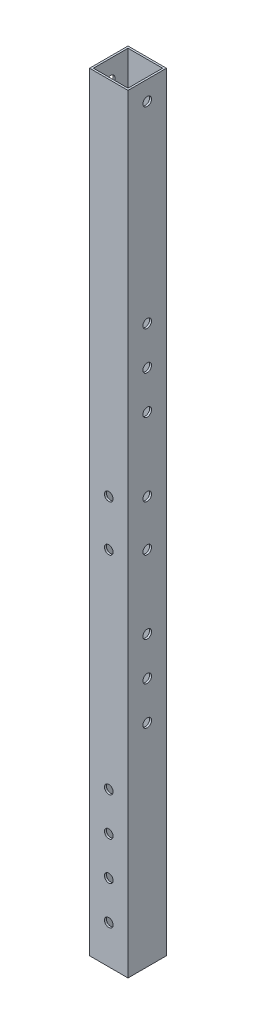
ISO-10303-21;
HEADER;
FILE_DESCRIPTION(('STEP AP214'),'2;1');
FILE_NAME('part.step','',(''),(''),'','','');
FILE_SCHEMA(('AUTOMOTIVE_DESIGN { 1 0 10303 214 1 1 1 1 }'));
ENDSEC;
DATA;
#1=APPLICATION_CONTEXT('core data for automotive mechanical design processes');
#2=APPLICATION_PROTOCOL_DEFINITION('international standard','automotive_design',2000,#1);
#3=PRODUCT_CONTEXT('',#1,'mechanical');
#4=PRODUCT('Part','Part','',(#3));
#5=PRODUCT_RELATED_PRODUCT_CATEGORY('part','',(#4));
#6=PRODUCT_DEFINITION_FORMATION('','',#4);
#7=PRODUCT_DEFINITION_CONTEXT('part definition',#1,'design');
#8=PRODUCT_DEFINITION('design','',#6,#7);
#9=PRODUCT_DEFINITION_SHAPE('','',#8);
#10=(LENGTH_UNIT() NAMED_UNIT(*) SI_UNIT(.MILLI.,.METRE.));
#11=(NAMED_UNIT(*) PLANE_ANGLE_UNIT() SI_UNIT($,.RADIAN.));
#12=(NAMED_UNIT(*) SI_UNIT($,.STERADIAN.) SOLID_ANGLE_UNIT());
#13=UNCERTAINTY_MEASURE_WITH_UNIT(LENGTH_MEASURE(1.E-05),#10,'distance_accuracy_value','');
#14=(GEOMETRIC_REPRESENTATION_CONTEXT(3) GLOBAL_UNCERTAINTY_ASSIGNED_CONTEXT((#13)) GLOBAL_UNIT_ASSIGNED_CONTEXT((#10,
#11,#12)) REPRESENTATION_CONTEXT('',''));
#15=CARTESIAN_POINT('',(0.,0.,0.));
#16=DIRECTION('',(0.,0.,1.));
#17=DIRECTION('',(1.,0.,0.));
#18=AXIS2_PLACEMENT_3D('',#15,#16,#17);
#19=CARTESIAN_POINT('',(0.,400.,0.));
#20=DIRECTION('',(0.,-1.,0.));
#21=DIRECTION('',(0.,0.,-1.));
#22=AXIS2_PLACEMENT_3D('',#19,#20,#21);
#23=PLANE('',#22);
#24=DIRECTION('',(0.,0.,-1.));
#25=VECTOR('',#24,1.);
#26=CARTESIAN_POINT('',(10.,400.,10.));
#27=LINE('',#26,#25);
#28=CARTESIAN_POINT('',(10.,400.,10.));
#29=VERTEX_POINT('',#28);
#30=CARTESIAN_POINT('',(10.,400.,-10.));
#31=VERTEX_POINT('',#30);
#32=EDGE_CURVE('E144',#29,#31,#27,.T.);
#33=ORIENTED_EDGE('',*,*,#32,.T.);
#34=DIRECTION('',(-1.,0.,0.));
#35=VECTOR('',#34,1.);
#36=CARTESIAN_POINT('',(-10.,400.,-10.));
#37=LINE('',#36,#35);
#38=CARTESIAN_POINT('',(-10.,400.,-10.));
#39=VERTEX_POINT('',#38);
#40=EDGE_CURVE('E147',#31,#39,#37,.T.);
#41=ORIENTED_EDGE('',*,*,#40,.T.);
#42=DIRECTION('',(0.,0.,1.));
#43=VECTOR('',#42,1.);
#44=CARTESIAN_POINT('',(-10.,400.,10.));
#45=LINE('',#44,#43);
#46=CARTESIAN_POINT('',(-10.,400.,10.));
#47=VERTEX_POINT('',#46);
#48=EDGE_CURVE('E150',#39,#47,#45,.T.);
#49=ORIENTED_EDGE('',*,*,#48,.T.);
#50=DIRECTION('',(1.,0.,0.));
#51=VECTOR('',#50,1.);
#52=CARTESIAN_POINT('',(-10.,400.,10.));
#53=LINE('',#52,#51);
#54=EDGE_CURVE('E152',#47,#29,#53,.T.);
#55=ORIENTED_EDGE('',*,*,#54,.T.);
#56=EDGE_LOOP('',(#33,#41,#49,#55));
#57=FACE_BOUND('',#56,.T.);
#58=DIRECTION('',(1.,0.,0.));
#59=VECTOR('',#58,1.);
#60=CARTESIAN_POINT('',(-9.,400.,9.));
#61=LINE('',#60,#59);
#62=CARTESIAN_POINT('',(-9.,400.,9.));
#63=VERTEX_POINT('',#62);
#64=CARTESIAN_POINT('',(9.,400.,9.));
#65=VERTEX_POINT('',#64);
#66=EDGE_CURVE('E106',#63,#65,#61,.T.);
#67=ORIENTED_EDGE('',*,*,#66,.F.);
#68=DIRECTION('',(0.,0.,1.));
#69=VECTOR('',#68,1.);
#70=CARTESIAN_POINT('',(-9.,400.,9.));
#71=LINE('',#70,#69);
#72=CARTESIAN_POINT('',(-9.,400.,-9.));
#73=VERTEX_POINT('',#72);
#74=EDGE_CURVE('E128',#73,#63,#71,.T.);
#75=ORIENTED_EDGE('',*,*,#74,.F.);
#76=DIRECTION('',(-1.,0.,0.));
#77=VECTOR('',#76,1.);
#78=CARTESIAN_POINT('',(-9.,400.,-9.));
#79=LINE('',#78,#77);
#80=CARTESIAN_POINT('',(9.,400.,-9.));
#81=VERTEX_POINT('',#80);
#82=EDGE_CURVE('E126',#81,#73,#79,.T.);
#83=ORIENTED_EDGE('',*,*,#82,.F.);
#84=DIRECTION('',(0.,0.,-1.));
#85=VECTOR('',#84,1.);
#86=CARTESIAN_POINT('',(9.,400.,9.));
#87=LINE('',#86,#85);
#88=EDGE_CURVE('E114',#65,#81,#87,.T.);
#89=ORIENTED_EDGE('',*,*,#88,.F.);
#90=EDGE_LOOP('',(#67,#75,#83,#89));
#91=FACE_BOUND('',#90,.T.);
#92=ADVANCED_FACE('F39',(#57,#91),#23,.F.);
#93=CARTESIAN_POINT('',(0.,0.,0.));
#94=DIRECTION('',(0.,-1.,0.));
#95=DIRECTION('',(0.,0.,-1.));
#96=AXIS2_PLACEMENT_3D('',#93,#94,#95);
#97=PLANE('',#96);
#98=DIRECTION('',(0.,0.,-1.));
#99=VECTOR('',#98,1.);
#100=CARTESIAN_POINT('',(10.,0.,10.));
#101=LINE('',#100,#99);
#102=CARTESIAN_POINT('',(10.,0.,10.));
#103=VERTEX_POINT('',#102);
#104=CARTESIAN_POINT('',(10.,0.,-10.));
#105=VERTEX_POINT('',#104);
#106=EDGE_CURVE('E122',#103,#105,#101,.T.);
#107=ORIENTED_EDGE('',*,*,#106,.F.);
#108=DIRECTION('',(1.,0.,0.));
#109=VECTOR('',#108,1.);
#110=CARTESIAN_POINT('',(-10.,0.,10.));
#111=LINE('',#110,#109);
#112=CARTESIAN_POINT('',(-10.,0.,10.));
#113=VERTEX_POINT('',#112);
#114=EDGE_CURVE('E148',#113,#103,#111,.T.);
#115=ORIENTED_EDGE('',*,*,#114,.F.);
#116=DIRECTION('',(0.,0.,1.));
#117=VECTOR('',#116,1.);
#118=CARTESIAN_POINT('',(-10.,0.,10.));
#119=LINE('',#118,#117);
#120=CARTESIAN_POINT('',(-10.,0.,-10.));
#121=VERTEX_POINT('',#120);
#122=EDGE_CURVE('E159',#121,#113,#119,.T.);
#123=ORIENTED_EDGE('',*,*,#122,.F.);
#124=DIRECTION('',(-1.,0.,0.));
#125=VECTOR('',#124,1.);
#126=CARTESIAN_POINT('',(-10.,0.,-10.));
#127=LINE('',#126,#125);
#128=EDGE_CURVE('E157',#105,#121,#127,.T.);
#129=ORIENTED_EDGE('',*,*,#128,.F.);
#130=EDGE_LOOP('',(#107,#115,#123,#129));
#131=FACE_BOUND('',#130,.T.);
#132=DIRECTION('',(0.,0.,1.));
#133=VECTOR('',#132,1.);
#134=CARTESIAN_POINT('',(-9.,0.,9.));
#135=LINE('',#134,#133);
#136=CARTESIAN_POINT('',(-9.,0.,-9.));
#137=VERTEX_POINT('',#136);
#138=CARTESIAN_POINT('',(-9.,0.,9.));
#139=VERTEX_POINT('',#138);
#140=EDGE_CURVE('E115',#137,#139,#135,.T.);
#141=ORIENTED_EDGE('',*,*,#140,.T.);
#142=DIRECTION('',(1.,0.,0.));
#143=VECTOR('',#142,1.);
#144=CARTESIAN_POINT('',(-9.,0.,9.));
#145=LINE('',#144,#143);
#146=CARTESIAN_POINT('',(9.,0.,9.));
#147=VERTEX_POINT('',#146);
#148=EDGE_CURVE('E64',#139,#147,#145,.T.);
#149=ORIENTED_EDGE('',*,*,#148,.T.);
#150=DIRECTION('',(0.,0.,-1.));
#151=VECTOR('',#150,1.);
#152=CARTESIAN_POINT('',(9.,0.,9.));
#153=LINE('',#152,#151);
#154=CARTESIAN_POINT('',(9.,0.,-9.));
#155=VERTEX_POINT('',#154);
#156=EDGE_CURVE('E121',#147,#155,#153,.T.);
#157=ORIENTED_EDGE('',*,*,#156,.T.);
#158=DIRECTION('',(-1.,0.,0.));
#159=VECTOR('',#158,1.);
#160=CARTESIAN_POINT('',(-9.,0.,-9.));
#161=LINE('',#160,#159);
#162=EDGE_CURVE('E136',#155,#137,#161,.T.);
#163=ORIENTED_EDGE('',*,*,#162,.T.);
#164=EDGE_LOOP('',(#141,#149,#157,#163));
#165=FACE_BOUND('',#164,.T.);
#166=ADVANCED_FACE('F326',(#131,#165),#97,.T.);
#167=CARTESIAN_POINT('',(10.,400.,10.));
#168=DIRECTION('',(-1.,0.,0.));
#169=DIRECTION('',(0.,0.,1.));
#170=AXIS2_PLACEMENT_3D('',#167,#168,#169);
#171=PLANE('',#170);
#172=CARTESIAN_POINT('',(10.,390.,0.));
#173=DIRECTION('',(-1.,0.,0.));
#174=DIRECTION('',(0.,0.,-1.));
#175=AXIS2_PLACEMENT_3D('',#172,#173,#174);
#176=CIRCLE('',#175,2.25);
#177=CARTESIAN_POINT('',(10.,390.,-2.25));
#178=VERTEX_POINT('',#177);
#179=EDGE_CURVE('E486',#178,#178,#176,.T.);
#180=ORIENTED_EDGE('',*,*,#179,.T.);
#181=EDGE_LOOP('',(#180));
#182=FACE_BOUND('',#181,.T.);
#183=CARTESIAN_POINT('',(10.,250.,0.));
#184=DIRECTION('',(-1.,0.,0.));
#185=DIRECTION('',(0.,0.,-1.));
#186=AXIS2_PLACEMENT_3D('',#183,#184,#185);
#187=CIRCLE('',#186,2.25);
#188=CARTESIAN_POINT('',(10.,250.,-2.25));
#189=VERTEX_POINT('',#188);
#190=EDGE_CURVE('E474',#189,#189,#187,.T.);
#191=ORIENTED_EDGE('',*,*,#190,.T.);
#192=EDGE_LOOP('',(#191));
#193=FACE_BOUND('',#192,.T.);
#194=CARTESIAN_POINT('',(10.,290.,0.));
#195=DIRECTION('',(-1.,0.,0.));
#196=DIRECTION('',(0.,0.,-1.));
#197=AXIS2_PLACEMENT_3D('',#194,#195,#196);
#198=CIRCLE('',#197,2.25);
#199=CARTESIAN_POINT('',(10.,290.,-2.25));
#200=VERTEX_POINT('',#199);
#201=EDGE_CURVE('E475',#200,#200,#198,.T.);
#202=ORIENTED_EDGE('',*,*,#201,.T.);
#203=EDGE_LOOP('',(#202));
#204=FACE_BOUND('',#203,.T.);
#205=CARTESIAN_POINT('',(10.,270.,0.));
#206=DIRECTION('',(-1.,0.,0.));
#207=DIRECTION('',(0.,0.,-1.));
#208=AXIS2_PLACEMENT_3D('',#205,#206,#207);
#209=CIRCLE('',#208,2.25);
#210=CARTESIAN_POINT('',(10.,270.,-2.25));
#211=VERTEX_POINT('',#210);
#212=EDGE_CURVE('E481',#211,#211,#209,.T.);
#213=ORIENTED_EDGE('',*,*,#212,.T.);
#214=EDGE_LOOP('',(#213));
#215=FACE_BOUND('',#214,.T.);
#216=CARTESIAN_POINT('',(10.,212.,0.));
#217=DIRECTION('',(-1.,0.,0.));
#218=DIRECTION('',(0.,0.,1.));
#219=AXIS2_PLACEMENT_3D('',#216,#217,#218);
#220=CIRCLE('',#219,2.25);
#221=CARTESIAN_POINT('',(10.,212.,2.25));
#222=VERTEX_POINT('',#221);
#223=EDGE_CURVE('E463',#222,#222,#220,.T.);
#224=ORIENTED_EDGE('',*,*,#223,.T.);
#225=EDGE_LOOP('',(#224));
#226=FACE_BOUND('',#225,.T.);
#227=CARTESIAN_POINT('',(10.,110.,0.));
#228=DIRECTION('',(-1.,0.,0.));
#229=DIRECTION('',(0.,0.,1.));
#230=AXIS2_PLACEMENT_3D('',#227,#228,#229);
#231=CIRCLE('',#230,2.25);
#232=CARTESIAN_POINT('',(10.,110.,2.25));
#233=VERTEX_POINT('',#232);
#234=EDGE_CURVE('E450',#233,#233,#231,.T.);
#235=ORIENTED_EDGE('',*,*,#234,.T.);
#236=EDGE_LOOP('',(#235));
#237=FACE_BOUND('',#236,.T.);
#238=CARTESIAN_POINT('',(10.,130.,0.));
#239=DIRECTION('',(-1.,0.,0.));
#240=DIRECTION('',(0.,0.,1.));
#241=AXIS2_PLACEMENT_3D('',#238,#239,#240);
#242=CIRCLE('',#241,2.25);
#243=CARTESIAN_POINT('',(10.,130.,2.25));
#244=VERTEX_POINT('',#243);
#245=EDGE_CURVE('E444',#244,#244,#242,.T.);
#246=ORIENTED_EDGE('',*,*,#245,.T.);
#247=EDGE_LOOP('',(#246));
#248=FACE_BOUND('',#247,.T.);
#249=CARTESIAN_POINT('',(10.,150.,0.));
#250=DIRECTION('',(-1.,0.,0.));
#251=DIRECTION('',(0.,0.,1.));
#252=AXIS2_PLACEMENT_3D('',#249,#250,#251);
#253=CIRCLE('',#252,2.25);
#254=CARTESIAN_POINT('',(10.,150.,2.25));
#255=VERTEX_POINT('',#254);
#256=EDGE_CURVE('E453',#255,#255,#253,.T.);
#257=ORIENTED_EDGE('',*,*,#256,.T.);
#258=EDGE_LOOP('',(#257));
#259=FACE_BOUND('',#258,.T.);
#260=CARTESIAN_POINT('',(10.,188.,0.));
#261=DIRECTION('',(-1.,0.,0.));
#262=DIRECTION('',(0.,0.,1.));
#263=AXIS2_PLACEMENT_3D('',#260,#261,#262);
#264=CIRCLE('',#263,2.25);
#265=CARTESIAN_POINT('',(10.,188.,2.25));
#266=VERTEX_POINT('',#265);
#267=EDGE_CURVE('E197',#266,#266,#264,.T.);
#268=ORIENTED_EDGE('',*,*,#267,.T.);
#269=EDGE_LOOP('',(#268));
#270=FACE_BOUND('',#269,.T.);
#271=ORIENTED_EDGE('',*,*,#106,.T.);
#272=DIRECTION('',(0.,-1.,0.));
#273=VECTOR('',#272,1.);
#274=CARTESIAN_POINT('',(10.,400.,-10.));
#275=LINE('',#274,#273);
#276=EDGE_CURVE('E11',#31,#105,#275,.T.);
#277=ORIENTED_EDGE('',*,*,#276,.F.);
#278=ORIENTED_EDGE('',*,*,#32,.F.);
#279=DIRECTION('',(0.,-1.,0.));
#280=VECTOR('',#279,1.);
#281=CARTESIAN_POINT('',(10.,400.,10.));
#282=LINE('',#281,#280);
#283=EDGE_CURVE('E154',#29,#103,#282,.T.);
#284=ORIENTED_EDGE('',*,*,#283,.T.);
#285=EDGE_LOOP('',(#271,#277,#278,#284));
#286=FACE_BOUND('',#285,.T.);
#287=ADVANCED_FACE('F41',(#182,#193,#204,#215,#226,#237,#248,#259,#270,#286),#171,.F.);
#288=CARTESIAN_POINT('',(-10.,400.,-10.));
#289=DIRECTION('',(0.,0.,1.));
#290=DIRECTION('',(1.,0.,0.));
#291=AXIS2_PLACEMENT_3D('',#288,#289,#290);
#292=PLANE('',#291);
#293=CARTESIAN_POINT('',(0.,20.,-10.));
#294=DIRECTION('',(0.,0.,-1.));
#295=DIRECTION('',(-1.,0.,0.));
#296=AXIS2_PLACEMENT_3D('',#293,#294,#295);
#297=CIRCLE('',#296,2.25);
#298=CARTESIAN_POINT('',(-2.25,20.,-10.));
#299=VERTEX_POINT('',#298);
#300=EDGE_CURVE('E241',#299,#299,#297,.T.);
#301=ORIENTED_EDGE('',*,*,#300,.F.);
#302=EDGE_LOOP('',(#301));
#303=FACE_BOUND('',#302,.T.);
#304=CARTESIAN_POINT('',(0.,40.,-10.));
#305=DIRECTION('',(0.,0.,-1.));
#306=DIRECTION('',(-1.,0.,0.));
#307=AXIS2_PLACEMENT_3D('',#304,#305,#306);
#308=CIRCLE('',#307,2.25);
#309=CARTESIAN_POINT('',(-2.25,40.,-10.));
#310=VERTEX_POINT('',#309);
#311=EDGE_CURVE('E244',#310,#310,#308,.T.);
#312=ORIENTED_EDGE('',*,*,#311,.F.);
#313=EDGE_LOOP('',(#312));
#314=FACE_BOUND('',#313,.T.);
#315=CARTESIAN_POINT('',(0.,60.,-10.));
#316=DIRECTION('',(0.,0.,-1.));
#317=DIRECTION('',(-1.,0.,0.));
#318=AXIS2_PLACEMENT_3D('',#315,#316,#317);
#319=CIRCLE('',#318,2.25);
#320=CARTESIAN_POINT('',(-2.25,60.,-10.));
#321=VERTEX_POINT('',#320);
#322=EDGE_CURVE('E250',#321,#321,#319,.T.);
#323=ORIENTED_EDGE('',*,*,#322,.F.);
#324=EDGE_LOOP('',(#323));
#325=FACE_BOUND('',#324,.T.);
#326=CARTESIAN_POINT('',(0.,80.,-10.));
#327=DIRECTION('',(0.,0.,-1.));
#328=DIRECTION('',(-1.,0.,0.));
#329=AXIS2_PLACEMENT_3D('',#326,#327,#328);
#330=CIRCLE('',#329,2.25);
#331=CARTESIAN_POINT('',(-2.25,80.,-10.));
#332=VERTEX_POINT('',#331);
#333=EDGE_CURVE('E256',#332,#332,#330,.T.);
#334=ORIENTED_EDGE('',*,*,#333,.F.);
#335=EDGE_LOOP('',(#334));
#336=FACE_BOUND('',#335,.T.);
#337=CARTESIAN_POINT('',(0.,188.,-10.));
#338=DIRECTION('',(0.,0.,-1.));
#339=DIRECTION('',(-1.,0.,0.));
#340=AXIS2_PLACEMENT_3D('',#337,#338,#339);
#341=CIRCLE('',#340,2.25);
#342=CARTESIAN_POINT('',(-2.25,188.,-10.));
#343=VERTEX_POINT('',#342);
#344=EDGE_CURVE('E262',#343,#343,#341,.T.);
#345=ORIENTED_EDGE('',*,*,#344,.F.);
#346=EDGE_LOOP('',(#345));
#347=FACE_BOUND('',#346,.T.);
#348=CARTESIAN_POINT('',(0.,212.,-10.));
#349=DIRECTION('',(0.,0.,-1.));
#350=DIRECTION('',(1.,0.,0.));
#351=AXIS2_PLACEMENT_3D('',#348,#349,#350);
#352=CIRCLE('',#351,2.25);
#353=CARTESIAN_POINT('',(2.25,212.,-10.));
#354=VERTEX_POINT('',#353);
#355=EDGE_CURVE('E268',#354,#354,#352,.T.);
#356=ORIENTED_EDGE('',*,*,#355,.F.);
#357=EDGE_LOOP('',(#356));
#358=FACE_BOUND('',#357,.T.);
#359=ORIENTED_EDGE('',*,*,#128,.T.);
#360=DIRECTION('',(0.,-1.,0.));
#361=VECTOR('',#360,1.);
#362=CARTESIAN_POINT('',(-10.,400.,-10.));
#363=LINE('',#362,#361);
#364=EDGE_CURVE('E48',#39,#121,#363,.T.);
#365=ORIENTED_EDGE('',*,*,#364,.F.);
#366=ORIENTED_EDGE('',*,*,#40,.F.);
#367=ORIENTED_EDGE('',*,*,#276,.T.);
#368=EDGE_LOOP('',(#359,#365,#366,#367));
#369=FACE_BOUND('',#368,.T.);
#370=ADVANCED_FACE('F330',(#303,#314,#325,#336,#347,#358,#369),#292,.F.);
#371=CARTESIAN_POINT('',(-10.,400.,10.));
#372=DIRECTION('',(1.,0.,0.));
#373=DIRECTION('',(0.,0.,-1.));
#374=AXIS2_PLACEMENT_3D('',#371,#372,#373);
#375=PLANE('',#374);
#376=CARTESIAN_POINT('',(-10.,390.,0.));
#377=DIRECTION('',(-1.,0.,0.));
#378=DIRECTION('',(0.,0.,-1.));
#379=AXIS2_PLACEMENT_3D('',#376,#377,#378);
#380=CIRCLE('',#379,2.25);
#381=CARTESIAN_POINT('',(-10.,390.,-2.25));
#382=VERTEX_POINT('',#381);
#383=EDGE_CURVE('E458',#382,#382,#380,.T.);
#384=ORIENTED_EDGE('',*,*,#383,.F.);
#385=EDGE_LOOP('',(#384));
#386=FACE_BOUND('',#385,.T.);
#387=CARTESIAN_POINT('',(-10.,250.,0.));
#388=DIRECTION('',(-1.,0.,0.));
#389=DIRECTION('',(0.,0.,-1.));
#390=AXIS2_PLACEMENT_3D('',#387,#388,#389);
#391=CIRCLE('',#390,2.25);
#392=CARTESIAN_POINT('',(-10.,250.,-2.25));
#393=VERTEX_POINT('',#392);
#394=EDGE_CURVE('E489',#393,#393,#391,.T.);
#395=ORIENTED_EDGE('',*,*,#394,.F.);
#396=EDGE_LOOP('',(#395));
#397=FACE_BOUND('',#396,.T.);
#398=CARTESIAN_POINT('',(-10.,290.,0.));
#399=DIRECTION('',(-1.,0.,0.));
#400=DIRECTION('',(0.,0.,-1.));
#401=AXIS2_PLACEMENT_3D('',#398,#399,#400);
#402=CIRCLE('',#401,2.25);
#403=CARTESIAN_POINT('',(-10.,290.,-2.25));
#404=VERTEX_POINT('',#403);
#405=EDGE_CURVE('E471',#404,#404,#402,.T.);
#406=ORIENTED_EDGE('',*,*,#405,.F.);
#407=EDGE_LOOP('',(#406));
#408=FACE_BOUND('',#407,.T.);
#409=CARTESIAN_POINT('',(-10.,270.,0.));
#410=DIRECTION('',(-1.,0.,0.));
#411=DIRECTION('',(0.,0.,-1.));
#412=AXIS2_PLACEMENT_3D('',#409,#410,#411);
#413=CIRCLE('',#412,2.25);
#414=CARTESIAN_POINT('',(-10.,270.,-2.25));
#415=VERTEX_POINT('',#414);
#416=EDGE_CURVE('E478',#415,#415,#413,.T.);
#417=ORIENTED_EDGE('',*,*,#416,.F.);
#418=EDGE_LOOP('',(#417));
#419=FACE_BOUND('',#418,.T.);
#420=CARTESIAN_POINT('',(-10.,212.,0.));
#421=DIRECTION('',(-1.,0.,0.));
#422=DIRECTION('',(0.,0.,1.));
#423=AXIS2_PLACEMENT_3D('',#420,#421,#422);
#424=CIRCLE('',#423,2.25);
#425=CARTESIAN_POINT('',(-10.,212.,2.25));
#426=VERTEX_POINT('',#425);
#427=EDGE_CURVE('E459',#426,#426,#424,.T.);
#428=ORIENTED_EDGE('',*,*,#427,.F.);
#429=EDGE_LOOP('',(#428));
#430=FACE_BOUND('',#429,.T.);
#431=CARTESIAN_POINT('',(-10.,110.,0.));
#432=DIRECTION('',(-1.,0.,0.));
#433=DIRECTION('',(0.,0.,1.));
#434=AXIS2_PLACEMENT_3D('',#431,#432,#433);
#435=CIRCLE('',#434,2.25);
#436=CARTESIAN_POINT('',(-10.,110.,2.25));
#437=VERTEX_POINT('',#436);
#438=EDGE_CURVE('E466',#437,#437,#435,.T.);
#439=ORIENTED_EDGE('',*,*,#438,.F.);
#440=EDGE_LOOP('',(#439));
#441=FACE_BOUND('',#440,.T.);
#442=CARTESIAN_POINT('',(-10.,130.,0.));
#443=DIRECTION('',(-1.,0.,0.));
#444=DIRECTION('',(0.,0.,1.));
#445=AXIS2_PLACEMENT_3D('',#442,#443,#444);
#446=CIRCLE('',#445,2.25);
#447=CARTESIAN_POINT('',(-10.,130.,2.25));
#448=VERTEX_POINT('',#447);
#449=EDGE_CURVE('E446',#448,#448,#446,.T.);
#450=ORIENTED_EDGE('',*,*,#449,.F.);
#451=EDGE_LOOP('',(#450));
#452=FACE_BOUND('',#451,.T.);
#453=CARTESIAN_POINT('',(-10.,150.,0.));
#454=DIRECTION('',(-1.,0.,0.));
#455=DIRECTION('',(0.,0.,1.));
#456=AXIS2_PLACEMENT_3D('',#453,#454,#455);
#457=CIRCLE('',#456,2.25);
#458=CARTESIAN_POINT('',(-10.,150.,2.25));
#459=VERTEX_POINT('',#458);
#460=EDGE_CURVE('E447',#459,#459,#457,.T.);
#461=ORIENTED_EDGE('',*,*,#460,.F.);
#462=EDGE_LOOP('',(#461));
#463=FACE_BOUND('',#462,.T.);
#464=CARTESIAN_POINT('',(-10.,188.,0.));
#465=DIRECTION('',(-1.,0.,0.));
#466=DIRECTION('',(0.,0.,1.));
#467=AXIS2_PLACEMENT_3D('',#464,#465,#466);
#468=CIRCLE('',#467,2.25);
#469=CARTESIAN_POINT('',(-10.,188.,2.25));
#470=VERTEX_POINT('',#469);
#471=EDGE_CURVE('E462',#470,#470,#468,.T.);
#472=ORIENTED_EDGE('',*,*,#471,.F.);
#473=EDGE_LOOP('',(#472));
#474=FACE_BOUND('',#473,.T.);
#475=ORIENTED_EDGE('',*,*,#122,.T.);
#476=DIRECTION('',(0.,-1.,0.));
#477=VECTOR('',#476,1.);
#478=CARTESIAN_POINT('',(-10.,400.,10.));
#479=LINE('',#478,#477);
#480=EDGE_CURVE('E164',#47,#113,#479,.T.);
#481=ORIENTED_EDGE('',*,*,#480,.F.);
#482=ORIENTED_EDGE('',*,*,#48,.F.);
#483=ORIENTED_EDGE('',*,*,#364,.T.);
#484=EDGE_LOOP('',(#475,#481,#482,#483));
#485=FACE_BOUND('',#484,.T.);
#486=ADVANCED_FACE('F313',(#386,#397,#408,#419,#430,#441,#452,#463,#474,#485),#375,.F.);
#487=CARTESIAN_POINT('',(-10.,400.,10.));
#488=DIRECTION('',(0.,0.,-1.));
#489=DIRECTION('',(-1.,0.,0.));
#490=AXIS2_PLACEMENT_3D('',#487,#488,#489);
#491=PLANE('',#490);
#492=CARTESIAN_POINT('',(0.,20.,10.));
#493=DIRECTION('',(0.,0.,-1.));
#494=DIRECTION('',(-1.,0.,0.));
#495=AXIS2_PLACEMENT_3D('',#492,#493,#494);
#496=CIRCLE('',#495,2.25);
#497=CARTESIAN_POINT('',(-2.25,20.,10.));
#498=VERTEX_POINT('',#497);
#499=EDGE_CURVE('E173',#498,#498,#496,.T.);
#500=ORIENTED_EDGE('',*,*,#499,.T.);
#501=EDGE_LOOP('',(#500));
#502=FACE_BOUND('',#501,.T.);
#503=CARTESIAN_POINT('',(0.,40.,10.));
#504=DIRECTION('',(0.,0.,-1.));
#505=DIRECTION('',(-1.,0.,0.));
#506=AXIS2_PLACEMENT_3D('',#503,#504,#505);
#507=CIRCLE('',#506,2.25);
#508=CARTESIAN_POINT('',(-2.25,40.,10.));
#509=VERTEX_POINT('',#508);
#510=EDGE_CURVE('E247',#509,#509,#507,.T.);
#511=ORIENTED_EDGE('',*,*,#510,.T.);
#512=EDGE_LOOP('',(#511));
#513=FACE_BOUND('',#512,.T.);
#514=CARTESIAN_POINT('',(0.,60.,10.));
#515=DIRECTION('',(0.,0.,-1.));
#516=DIRECTION('',(-1.,0.,0.));
#517=AXIS2_PLACEMENT_3D('',#514,#515,#516);
#518=CIRCLE('',#517,2.25);
#519=CARTESIAN_POINT('',(-2.25,60.,10.));
#520=VERTEX_POINT('',#519);
#521=EDGE_CURVE('E253',#520,#520,#518,.T.);
#522=ORIENTED_EDGE('',*,*,#521,.T.);
#523=EDGE_LOOP('',(#522));
#524=FACE_BOUND('',#523,.T.);
#525=CARTESIAN_POINT('',(0.,80.,10.));
#526=DIRECTION('',(0.,0.,-1.));
#527=DIRECTION('',(-1.,0.,0.));
#528=AXIS2_PLACEMENT_3D('',#525,#526,#527);
#529=CIRCLE('',#528,2.25);
#530=CARTESIAN_POINT('',(-2.25,80.,10.));
#531=VERTEX_POINT('',#530);
#532=EDGE_CURVE('E259',#531,#531,#529,.T.);
#533=ORIENTED_EDGE('',*,*,#532,.T.);
#534=EDGE_LOOP('',(#533));
#535=FACE_BOUND('',#534,.T.);
#536=CARTESIAN_POINT('',(0.,188.,10.));
#537=DIRECTION('',(0.,0.,-1.));
#538=DIRECTION('',(-1.,0.,0.));
#539=AXIS2_PLACEMENT_3D('',#536,#537,#538);
#540=CIRCLE('',#539,2.25);
#541=CARTESIAN_POINT('',(-2.25,188.,10.));
#542=VERTEX_POINT('',#541);
#543=EDGE_CURVE('E265',#542,#542,#540,.T.);
#544=ORIENTED_EDGE('',*,*,#543,.T.);
#545=EDGE_LOOP('',(#544));
#546=FACE_BOUND('',#545,.T.);
#547=CARTESIAN_POINT('',(0.,212.,10.));
#548=DIRECTION('',(0.,0.,-1.));
#549=DIRECTION('',(1.,0.,0.));
#550=AXIS2_PLACEMENT_3D('',#547,#548,#549);
#551=CIRCLE('',#550,2.25);
#552=CARTESIAN_POINT('',(2.25,212.,10.));
#553=VERTEX_POINT('',#552);
#554=EDGE_CURVE('E238',#553,#553,#551,.T.);
#555=ORIENTED_EDGE('',*,*,#554,.T.);
#556=EDGE_LOOP('',(#555));
#557=FACE_BOUND('',#556,.T.);
#558=ORIENTED_EDGE('',*,*,#114,.T.);
#559=ORIENTED_EDGE('',*,*,#283,.F.);
#560=ORIENTED_EDGE('',*,*,#54,.F.);
#561=ORIENTED_EDGE('',*,*,#480,.T.);
#562=EDGE_LOOP('',(#558,#559,#560,#561));
#563=FACE_BOUND('',#562,.T.);
#564=ADVANCED_FACE('F290',(#502,#513,#524,#535,#546,#557,#563),#491,.F.);
#565=CARTESIAN_POINT('',(-9.,400.,9.));
#566=DIRECTION('',(0.,0.,-1.));
#567=DIRECTION('',(-1.,0.,0.));
#568=AXIS2_PLACEMENT_3D('',#565,#566,#567);
#569=PLANE('',#568);
#570=CARTESIAN_POINT('',(0.,20.,9.));
#571=DIRECTION('',(0.,0.,-1.));
#572=DIRECTION('',(-1.,0.,0.));
#573=AXIS2_PLACEMENT_3D('',#570,#571,#572);
#574=CIRCLE('',#573,2.25);
#575=CARTESIAN_POINT('',(-2.25,20.,9.));
#576=VERTEX_POINT('',#575);
#577=EDGE_CURVE('E134',#576,#576,#574,.T.);
#578=ORIENTED_EDGE('',*,*,#577,.F.);
#579=EDGE_LOOP('',(#578));
#580=FACE_BOUND('',#579,.T.);
#581=CARTESIAN_POINT('',(0.,40.,9.));
#582=DIRECTION('',(0.,0.,-1.));
#583=DIRECTION('',(-1.,0.,0.));
#584=AXIS2_PLACEMENT_3D('',#581,#582,#583);
#585=CIRCLE('',#584,2.25);
#586=CARTESIAN_POINT('',(-2.25,40.,9.));
#587=VERTEX_POINT('',#586);
#588=EDGE_CURVE('E189',#587,#587,#585,.T.);
#589=ORIENTED_EDGE('',*,*,#588,.F.);
#590=EDGE_LOOP('',(#589));
#591=FACE_BOUND('',#590,.T.);
#592=CARTESIAN_POINT('',(0.,60.,9.));
#593=DIRECTION('',(0.,0.,-1.));
#594=DIRECTION('',(-1.,0.,0.));
#595=AXIS2_PLACEMENT_3D('',#592,#593,#594);
#596=CIRCLE('',#595,2.25);
#597=CARTESIAN_POINT('',(-2.25,60.,9.));
#598=VERTEX_POINT('',#597);
#599=EDGE_CURVE('E185',#598,#598,#596,.T.);
#600=ORIENTED_EDGE('',*,*,#599,.F.);
#601=EDGE_LOOP('',(#600));
#602=FACE_BOUND('',#601,.T.);
#603=CARTESIAN_POINT('',(0.,80.,9.));
#604=DIRECTION('',(0.,0.,-1.));
#605=DIRECTION('',(-1.,0.,0.));
#606=AXIS2_PLACEMENT_3D('',#603,#604,#605);
#607=CIRCLE('',#606,2.25);
#608=CARTESIAN_POINT('',(-2.25,80.,9.));
#609=VERTEX_POINT('',#608);
#610=EDGE_CURVE('E181',#609,#609,#607,.T.);
#611=ORIENTED_EDGE('',*,*,#610,.F.);
#612=EDGE_LOOP('',(#611));
#613=FACE_BOUND('',#612,.T.);
#614=CARTESIAN_POINT('',(0.,188.,9.));
#615=DIRECTION('',(0.,0.,-1.));
#616=DIRECTION('',(-1.,0.,0.));
#617=AXIS2_PLACEMENT_3D('',#614,#615,#616);
#618=CIRCLE('',#617,2.25);
#619=CARTESIAN_POINT('',(-2.25,188.,9.));
#620=VERTEX_POINT('',#619);
#621=EDGE_CURVE('E177',#620,#620,#618,.T.);
#622=ORIENTED_EDGE('',*,*,#621,.F.);
#623=EDGE_LOOP('',(#622));
#624=FACE_BOUND('',#623,.T.);
#625=CARTESIAN_POINT('',(0.,212.,9.));
#626=DIRECTION('',(0.,0.,-1.));
#627=DIRECTION('',(-1.,0.,0.));
#628=AXIS2_PLACEMENT_3D('',#625,#626,#627);
#629=CIRCLE('',#628,2.25);
#630=CARTESIAN_POINT('',(-2.25,212.,9.));
#631=VERTEX_POINT('',#630);
#632=EDGE_CURVE('E172',#631,#631,#629,.T.);
#633=ORIENTED_EDGE('',*,*,#632,.F.);
#634=EDGE_LOOP('',(#633));
#635=FACE_BOUND('',#634,.T.);
#636=ORIENTED_EDGE('',*,*,#148,.F.);
#637=DIRECTION('',(0.,-1.,0.));
#638=VECTOR('',#637,1.);
#639=CARTESIAN_POINT('',(-9.,400.,9.));
#640=LINE('',#639,#638);
#641=EDGE_CURVE('E110',#63,#139,#640,.T.);
#642=ORIENTED_EDGE('',*,*,#641,.F.);
#643=ORIENTED_EDGE('',*,*,#66,.T.);
#644=DIRECTION('',(0.,-1.,0.));
#645=VECTOR('',#644,1.);
#646=CARTESIAN_POINT('',(9.,400.,9.));
#647=LINE('',#646,#645);
#648=EDGE_CURVE('E109',#65,#147,#647,.T.);
#649=ORIENTED_EDGE('',*,*,#648,.T.);
#650=EDGE_LOOP('',(#636,#642,#643,#649));
#651=FACE_BOUND('',#650,.T.);
#652=ADVANCED_FACE('F108',(#580,#591,#602,#613,#624,#635,#651),#569,.T.);
#653=CARTESIAN_POINT('',(9.,400.,9.));
#654=DIRECTION('',(-1.,0.,0.));
#655=DIRECTION('',(0.,0.,1.));
#656=AXIS2_PLACEMENT_3D('',#653,#654,#655);
#657=PLANE('',#656);
#658=CARTESIAN_POINT('',(9.,390.,0.));
#659=DIRECTION('',(-1.,0.,0.));
#660=DIRECTION('',(0.,0.,1.));
#661=AXIS2_PLACEMENT_3D('',#658,#659,#660);
#662=CIRCLE('',#661,2.25);
#663=CARTESIAN_POINT('',(9.,390.,2.25));
#664=VERTEX_POINT('',#663);
#665=EDGE_CURVE('E235',#664,#664,#662,.T.);
#666=ORIENTED_EDGE('',*,*,#665,.F.);
#667=EDGE_LOOP('',(#666));
#668=FACE_BOUND('',#667,.T.);
#669=CARTESIAN_POINT('',(9.,250.,0.));
#670=DIRECTION('',(-1.,0.,0.));
#671=DIRECTION('',(0.,0.,1.));
#672=AXIS2_PLACEMENT_3D('',#669,#670,#671);
#673=CIRCLE('',#672,2.25);
#674=CARTESIAN_POINT('',(9.,250.,2.25));
#675=VERTEX_POINT('',#674);
#676=EDGE_CURVE('E223',#675,#675,#673,.T.);
#677=ORIENTED_EDGE('',*,*,#676,.F.);
#678=EDGE_LOOP('',(#677));
#679=FACE_BOUND('',#678,.T.);
#680=CARTESIAN_POINT('',(9.,290.,0.));
#681=DIRECTION('',(-1.,0.,0.));
#682=DIRECTION('',(0.,0.,1.));
#683=AXIS2_PLACEMENT_3D('',#680,#681,#682);
#684=CIRCLE('',#683,2.25);
#685=CARTESIAN_POINT('',(9.,290.,2.25));
#686=VERTEX_POINT('',#685);
#687=EDGE_CURVE('E220',#686,#686,#684,.T.);
#688=ORIENTED_EDGE('',*,*,#687,.F.);
#689=EDGE_LOOP('',(#688));
#690=FACE_BOUND('',#689,.T.);
#691=CARTESIAN_POINT('',(9.,270.,0.));
#692=DIRECTION('',(-1.,0.,0.));
#693=DIRECTION('',(0.,0.,1.));
#694=AXIS2_PLACEMENT_3D('',#691,#692,#693);
#695=CIRCLE('',#694,2.25);
#696=CARTESIAN_POINT('',(9.,270.,2.25));
#697=VERTEX_POINT('',#696);
#698=EDGE_CURVE('E217',#697,#697,#695,.T.);
#699=ORIENTED_EDGE('',*,*,#698,.F.);
#700=EDGE_LOOP('',(#699));
#701=FACE_BOUND('',#700,.T.);
#702=CARTESIAN_POINT('',(9.,212.,0.));
#703=DIRECTION('',(-1.,0.,0.));
#704=DIRECTION('',(0.,0.,1.));
#705=AXIS2_PLACEMENT_3D('',#702,#703,#704);
#706=CIRCLE('',#705,2.25);
#707=CARTESIAN_POINT('',(9.,212.,2.25));
#708=VERTEX_POINT('',#707);
#709=EDGE_CURVE('E213',#708,#708,#706,.T.);
#710=ORIENTED_EDGE('',*,*,#709,.F.);
#711=EDGE_LOOP('',(#710));
#712=FACE_BOUND('',#711,.T.);
#713=CARTESIAN_POINT('',(9.,110.,0.));
#714=DIRECTION('',(-1.,0.,0.));
#715=DIRECTION('',(0.,0.,1.));
#716=AXIS2_PLACEMENT_3D('',#713,#714,#715);
#717=CIRCLE('',#716,2.25);
#718=CARTESIAN_POINT('',(9.,110.,2.25));
#719=VERTEX_POINT('',#718);
#720=EDGE_CURVE('E209',#719,#719,#717,.T.);
#721=ORIENTED_EDGE('',*,*,#720,.F.);
#722=EDGE_LOOP('',(#721));
#723=FACE_BOUND('',#722,.T.);
#724=CARTESIAN_POINT('',(9.,130.,0.));
#725=DIRECTION('',(-1.,0.,0.));
#726=DIRECTION('',(0.,0.,1.));
#727=AXIS2_PLACEMENT_3D('',#724,#725,#726);
#728=CIRCLE('',#727,2.25);
#729=CARTESIAN_POINT('',(9.,130.,2.25));
#730=VERTEX_POINT('',#729);
#731=EDGE_CURVE('E205',#730,#730,#728,.T.);
#732=ORIENTED_EDGE('',*,*,#731,.F.);
#733=EDGE_LOOP('',(#732));
#734=FACE_BOUND('',#733,.T.);
#735=CARTESIAN_POINT('',(9.,150.,0.));
#736=DIRECTION('',(-1.,0.,0.));
#737=DIRECTION('',(0.,0.,1.));
#738=AXIS2_PLACEMENT_3D('',#735,#736,#737);
#739=CIRCLE('',#738,2.25);
#740=CARTESIAN_POINT('',(9.,150.,2.25));
#741=VERTEX_POINT('',#740);
#742=EDGE_CURVE('E201',#741,#741,#739,.T.);
#743=ORIENTED_EDGE('',*,*,#742,.F.);
#744=EDGE_LOOP('',(#743));
#745=FACE_BOUND('',#744,.T.);
#746=CARTESIAN_POINT('',(9.,188.,0.));
#747=DIRECTION('',(-1.,0.,0.));
#748=DIRECTION('',(0.,0.,1.));
#749=AXIS2_PLACEMENT_3D('',#746,#747,#748);
#750=CIRCLE('',#749,2.25);
#751=CARTESIAN_POINT('',(9.,188.,2.25));
#752=VERTEX_POINT('',#751);
#753=EDGE_CURVE('E196',#752,#752,#750,.T.);
#754=ORIENTED_EDGE('',*,*,#753,.F.);
#755=EDGE_LOOP('',(#754));
#756=FACE_BOUND('',#755,.T.);
#757=ORIENTED_EDGE('',*,*,#156,.F.);
#758=ORIENTED_EDGE('',*,*,#648,.F.);
#759=ORIENTED_EDGE('',*,*,#88,.T.);
#760=DIRECTION('',(0.,-1.,0.));
#761=VECTOR('',#760,1.);
#762=CARTESIAN_POINT('',(9.,400.,-9.));
#763=LINE('',#762,#761);
#764=EDGE_CURVE('E123',#81,#155,#763,.T.);
#765=ORIENTED_EDGE('',*,*,#764,.T.);
#766=EDGE_LOOP('',(#757,#758,#759,#765));
#767=FACE_BOUND('',#766,.T.);
#768=ADVANCED_FACE('F118',(#668,#679,#690,#701,#712,#723,#734,#745,#756,#767),#657,.T.);
#769=CARTESIAN_POINT('',(-9.,400.,-9.));
#770=DIRECTION('',(0.,0.,1.));
#771=DIRECTION('',(1.,0.,0.));
#772=AXIS2_PLACEMENT_3D('',#769,#770,#771);
#773=PLANE('',#772);
#774=CARTESIAN_POINT('',(0.,20.,-9.));
#775=DIRECTION('',(0.,0.,1.));
#776=DIRECTION('',(1.,0.,0.));
#777=AXIS2_PLACEMENT_3D('',#774,#775,#776);
#778=CIRCLE('',#777,2.25);
#779=CARTESIAN_POINT('',(2.25,20.,-9.));
#780=VERTEX_POINT('',#779);
#781=EDGE_CURVE('E190',#780,#780,#778,.T.);
#782=ORIENTED_EDGE('',*,*,#781,.F.);
#783=EDGE_LOOP('',(#782));
#784=FACE_BOUND('',#783,.T.);
#785=CARTESIAN_POINT('',(0.,40.,-9.));
#786=DIRECTION('',(0.,0.,1.));
#787=DIRECTION('',(1.,0.,0.));
#788=AXIS2_PLACEMENT_3D('',#785,#786,#787);
#789=CIRCLE('',#788,2.25);
#790=CARTESIAN_POINT('',(2.25,40.,-9.));
#791=VERTEX_POINT('',#790);
#792=EDGE_CURVE('E186',#791,#791,#789,.T.);
#793=ORIENTED_EDGE('',*,*,#792,.F.);
#794=EDGE_LOOP('',(#793));
#795=FACE_BOUND('',#794,.T.);
#796=CARTESIAN_POINT('',(0.,60.,-9.));
#797=DIRECTION('',(0.,0.,1.));
#798=DIRECTION('',(1.,0.,0.));
#799=AXIS2_PLACEMENT_3D('',#796,#797,#798);
#800=CIRCLE('',#799,2.25);
#801=CARTESIAN_POINT('',(2.25,60.,-9.));
#802=VERTEX_POINT('',#801);
#803=EDGE_CURVE('E182',#802,#802,#800,.T.);
#804=ORIENTED_EDGE('',*,*,#803,.F.);
#805=EDGE_LOOP('',(#804));
#806=FACE_BOUND('',#805,.T.);
#807=CARTESIAN_POINT('',(0.,80.,-9.));
#808=DIRECTION('',(0.,0.,1.));
#809=DIRECTION('',(1.,0.,0.));
#810=AXIS2_PLACEMENT_3D('',#807,#808,#809);
#811=CIRCLE('',#810,2.25);
#812=CARTESIAN_POINT('',(2.25,80.,-9.));
#813=VERTEX_POINT('',#812);
#814=EDGE_CURVE('E178',#813,#813,#811,.T.);
#815=ORIENTED_EDGE('',*,*,#814,.F.);
#816=EDGE_LOOP('',(#815));
#817=FACE_BOUND('',#816,.T.);
#818=CARTESIAN_POINT('',(0.,188.,-9.));
#819=DIRECTION('',(0.,0.,1.));
#820=DIRECTION('',(1.,0.,0.));
#821=AXIS2_PLACEMENT_3D('',#818,#819,#820);
#822=CIRCLE('',#821,2.25);
#823=CARTESIAN_POINT('',(2.25,188.,-9.));
#824=VERTEX_POINT('',#823);
#825=EDGE_CURVE('E174',#824,#824,#822,.T.);
#826=ORIENTED_EDGE('',*,*,#825,.F.);
#827=EDGE_LOOP('',(#826));
#828=FACE_BOUND('',#827,.T.);
#829=CARTESIAN_POINT('',(0.,212.,-9.));
#830=DIRECTION('',(0.,0.,1.));
#831=DIRECTION('',(1.,0.,0.));
#832=AXIS2_PLACEMENT_3D('',#829,#830,#831);
#833=CIRCLE('',#832,2.25);
#834=CARTESIAN_POINT('',(2.25,212.,-9.));
#835=VERTEX_POINT('',#834);
#836=EDGE_CURVE('E169',#835,#835,#833,.T.);
#837=ORIENTED_EDGE('',*,*,#836,.F.);
#838=EDGE_LOOP('',(#837));
#839=FACE_BOUND('',#838,.T.);
#840=ORIENTED_EDGE('',*,*,#162,.F.);
#841=ORIENTED_EDGE('',*,*,#764,.F.);
#842=ORIENTED_EDGE('',*,*,#82,.T.);
#843=DIRECTION('',(0.,-1.,0.));
#844=VECTOR('',#843,1.);
#845=CARTESIAN_POINT('',(-9.,400.,-9.));
#846=LINE('',#845,#844);
#847=EDGE_CURVE('E56',#73,#137,#846,.T.);
#848=ORIENTED_EDGE('',*,*,#847,.T.);
#849=EDGE_LOOP('',(#840,#841,#842,#848));
#850=FACE_BOUND('',#849,.T.);
#851=ADVANCED_FACE('F352',(#784,#795,#806,#817,#828,#839,#850),#773,.T.);
#852=CARTESIAN_POINT('',(-9.,400.,9.));
#853=DIRECTION('',(1.,0.,0.));
#854=DIRECTION('',(0.,0.,-1.));
#855=AXIS2_PLACEMENT_3D('',#852,#853,#854);
#856=PLANE('',#855);
#857=CARTESIAN_POINT('',(-9.,390.,0.));
#858=DIRECTION('',(1.,0.,0.));
#859=DIRECTION('',(0.,0.,-1.));
#860=AXIS2_PLACEMENT_3D('',#857,#858,#859);
#861=CIRCLE('',#860,2.25);
#862=CARTESIAN_POINT('',(-9.,390.,-2.25));
#863=VERTEX_POINT('',#862);
#864=EDGE_CURVE('E43',#863,#863,#861,.T.);
#865=ORIENTED_EDGE('',*,*,#864,.F.);
#866=EDGE_LOOP('',(#865));
#867=FACE_BOUND('',#866,.T.);
#868=CARTESIAN_POINT('',(-9.,250.,0.));
#869=DIRECTION('',(1.,0.,0.));
#870=DIRECTION('',(0.,0.,-1.));
#871=AXIS2_PLACEMENT_3D('',#868,#869,#870);
#872=CIRCLE('',#871,2.25);
#873=CARTESIAN_POINT('',(-9.,250.,-2.25));
#874=VERTEX_POINT('',#873);
#875=EDGE_CURVE('E221',#874,#874,#872,.T.);
#876=ORIENTED_EDGE('',*,*,#875,.F.);
#877=EDGE_LOOP('',(#876));
#878=FACE_BOUND('',#877,.T.);
#879=CARTESIAN_POINT('',(-9.,290.,0.));
#880=DIRECTION('',(1.,0.,0.));
#881=DIRECTION('',(0.,0.,-1.));
#882=AXIS2_PLACEMENT_3D('',#879,#880,#881);
#883=CIRCLE('',#882,2.25);
#884=CARTESIAN_POINT('',(-9.,290.,-2.25));
#885=VERTEX_POINT('',#884);
#886=EDGE_CURVE('E218',#885,#885,#883,.T.);
#887=ORIENTED_EDGE('',*,*,#886,.F.);
#888=EDGE_LOOP('',(#887));
#889=FACE_BOUND('',#888,.T.);
#890=CARTESIAN_POINT('',(-9.,270.,0.));
#891=DIRECTION('',(1.,0.,0.));
#892=DIRECTION('',(0.,0.,-1.));
#893=AXIS2_PLACEMENT_3D('',#890,#891,#892);
#894=CIRCLE('',#893,2.25);
#895=CARTESIAN_POINT('',(-9.,270.,-2.25));
#896=VERTEX_POINT('',#895);
#897=EDGE_CURVE('E214',#896,#896,#894,.T.);
#898=ORIENTED_EDGE('',*,*,#897,.F.);
#899=EDGE_LOOP('',(#898));
#900=FACE_BOUND('',#899,.T.);
#901=CARTESIAN_POINT('',(-9.,212.,0.));
#902=DIRECTION('',(1.,0.,0.));
#903=DIRECTION('',(0.,0.,-1.));
#904=AXIS2_PLACEMENT_3D('',#901,#902,#903);
#905=CIRCLE('',#904,2.25);
#906=CARTESIAN_POINT('',(-9.,212.,-2.25));
#907=VERTEX_POINT('',#906);
#908=EDGE_CURVE('E210',#907,#907,#905,.T.);
#909=ORIENTED_EDGE('',*,*,#908,.F.);
#910=EDGE_LOOP('',(#909));
#911=FACE_BOUND('',#910,.T.);
#912=CARTESIAN_POINT('',(-9.,110.,0.));
#913=DIRECTION('',(1.,0.,0.));
#914=DIRECTION('',(0.,0.,-1.));
#915=AXIS2_PLACEMENT_3D('',#912,#913,#914);
#916=CIRCLE('',#915,2.25);
#917=CARTESIAN_POINT('',(-9.,110.,-2.25));
#918=VERTEX_POINT('',#917);
#919=EDGE_CURVE('E206',#918,#918,#916,.T.);
#920=ORIENTED_EDGE('',*,*,#919,.F.);
#921=EDGE_LOOP('',(#920));
#922=FACE_BOUND('',#921,.T.);
#923=CARTESIAN_POINT('',(-9.,130.,0.));
#924=DIRECTION('',(1.,0.,0.));
#925=DIRECTION('',(0.,0.,-1.));
#926=AXIS2_PLACEMENT_3D('',#923,#924,#925);
#927=CIRCLE('',#926,2.25);
#928=CARTESIAN_POINT('',(-9.,130.,-2.25));
#929=VERTEX_POINT('',#928);
#930=EDGE_CURVE('E202',#929,#929,#927,.T.);
#931=ORIENTED_EDGE('',*,*,#930,.F.);
#932=EDGE_LOOP('',(#931));
#933=FACE_BOUND('',#932,.T.);
#934=CARTESIAN_POINT('',(-9.,150.,0.));
#935=DIRECTION('',(1.,0.,0.));
#936=DIRECTION('',(0.,0.,-1.));
#937=AXIS2_PLACEMENT_3D('',#934,#935,#936);
#938=CIRCLE('',#937,2.25);
#939=CARTESIAN_POINT('',(-9.,150.,-2.25));
#940=VERTEX_POINT('',#939);
#941=EDGE_CURVE('E198',#940,#940,#938,.T.);
#942=ORIENTED_EDGE('',*,*,#941,.F.);
#943=EDGE_LOOP('',(#942));
#944=FACE_BOUND('',#943,.T.);
#945=CARTESIAN_POINT('',(-9.,188.,0.));
#946=DIRECTION('',(1.,0.,0.));
#947=DIRECTION('',(0.,0.,-1.));
#948=AXIS2_PLACEMENT_3D('',#945,#946,#947);
#949=CIRCLE('',#948,2.25);
#950=CARTESIAN_POINT('',(-9.,188.,-2.25));
#951=VERTEX_POINT('',#950);
#952=EDGE_CURVE('E193',#951,#951,#949,.T.);
#953=ORIENTED_EDGE('',*,*,#952,.F.);
#954=EDGE_LOOP('',(#953));
#955=FACE_BOUND('',#954,.T.);
#956=ORIENTED_EDGE('',*,*,#140,.F.);
#957=ORIENTED_EDGE('',*,*,#847,.F.);
#958=ORIENTED_EDGE('',*,*,#74,.T.);
#959=ORIENTED_EDGE('',*,*,#641,.T.);
#960=EDGE_LOOP('',(#956,#957,#958,#959));
#961=FACE_BOUND('',#960,.T.);
#962=ADVANCED_FACE('F356',(#867,#878,#889,#900,#911,#922,#933,#944,#955,#961),#856,.T.);
#963=CARTESIAN_POINT('',(0.,212.,10.));
#964=DIRECTION('',(0.,0.,-1.));
#965=DIRECTION('',(-1.,0.,0.));
#966=AXIS2_PLACEMENT_3D('',#963,#964,#965);
#967=CYLINDRICAL_SURFACE('',#966,2.25);
#968=ORIENTED_EDGE('',*,*,#836,.T.);
#969=EDGE_LOOP('',(#968));
#970=FACE_BOUND('',#969,.T.);
#971=ORIENTED_EDGE('',*,*,#355,.T.);
#972=EDGE_LOOP('',(#971));
#973=FACE_BOUND('',#972,.T.);
#974=ADVANCED_FACE('F308',(#970,#973),#967,.F.);
#975=CARTESIAN_POINT('',(0.,188.,10.));
#976=DIRECTION('',(0.,0.,-1.));
#977=DIRECTION('',(-1.,0.,0.));
#978=AXIS2_PLACEMENT_3D('',#975,#976,#977);
#979=CYLINDRICAL_SURFACE('',#978,2.25);
#980=ORIENTED_EDGE('',*,*,#825,.T.);
#981=EDGE_LOOP('',(#980));
#982=FACE_BOUND('',#981,.T.);
#983=ORIENTED_EDGE('',*,*,#344,.T.);
#984=EDGE_LOOP('',(#983));
#985=FACE_BOUND('',#984,.T.);
#986=ADVANCED_FACE('F362',(#982,#985),#979,.F.);
#987=CARTESIAN_POINT('',(0.,80.,10.));
#988=DIRECTION('',(0.,0.,-1.));
#989=DIRECTION('',(-1.,0.,0.));
#990=AXIS2_PLACEMENT_3D('',#987,#988,#989);
#991=CYLINDRICAL_SURFACE('',#990,2.25);
#992=ORIENTED_EDGE('',*,*,#814,.T.);
#993=EDGE_LOOP('',(#992));
#994=FACE_BOUND('',#993,.T.);
#995=ORIENTED_EDGE('',*,*,#333,.T.);
#996=EDGE_LOOP('',(#995));
#997=FACE_BOUND('',#996,.T.);
#998=ADVANCED_FACE('F366',(#994,#997),#991,.F.);
#999=CARTESIAN_POINT('',(0.,60.,10.));
#1000=DIRECTION('',(0.,0.,-1.));
#1001=DIRECTION('',(-1.,0.,0.));
#1002=AXIS2_PLACEMENT_3D('',#999,#1000,#1001);
#1003=CYLINDRICAL_SURFACE('',#1002,2.25);
#1004=ORIENTED_EDGE('',*,*,#803,.T.);
#1005=EDGE_LOOP('',(#1004));
#1006=FACE_BOUND('',#1005,.T.);
#1007=ORIENTED_EDGE('',*,*,#322,.T.);
#1008=EDGE_LOOP('',(#1007));
#1009=FACE_BOUND('',#1008,.T.);
#1010=ADVANCED_FACE('F370',(#1006,#1009),#1003,.F.);
#1011=CARTESIAN_POINT('',(0.,40.,10.));
#1012=DIRECTION('',(0.,0.,-1.));
#1013=DIRECTION('',(-1.,0.,0.));
#1014=AXIS2_PLACEMENT_3D('',#1011,#1012,#1013);
#1015=CYLINDRICAL_SURFACE('',#1014,2.25);
#1016=ORIENTED_EDGE('',*,*,#792,.T.);
#1017=EDGE_LOOP('',(#1016));
#1018=FACE_BOUND('',#1017,.T.);
#1019=ORIENTED_EDGE('',*,*,#311,.T.);
#1020=EDGE_LOOP('',(#1019));
#1021=FACE_BOUND('',#1020,.T.);
#1022=ADVANCED_FACE('F375',(#1018,#1021),#1015,.F.);
#1023=CARTESIAN_POINT('',(0.,20.,10.));
#1024=DIRECTION('',(0.,0.,-1.));
#1025=DIRECTION('',(-1.,0.,0.));
#1026=AXIS2_PLACEMENT_3D('',#1023,#1024,#1025);
#1027=CYLINDRICAL_SURFACE('',#1026,2.25);
#1028=ORIENTED_EDGE('',*,*,#781,.T.);
#1029=EDGE_LOOP('',(#1028));
#1030=FACE_BOUND('',#1029,.T.);
#1031=ORIENTED_EDGE('',*,*,#300,.T.);
#1032=EDGE_LOOP('',(#1031));
#1033=FACE_BOUND('',#1032,.T.);
#1034=ADVANCED_FACE('F306',(#1030,#1033),#1027,.F.);
#1035=ORIENTED_EDGE('',*,*,#632,.T.);
#1036=EDGE_LOOP('',(#1035));
#1037=FACE_BOUND('',#1036,.T.);
#1038=ORIENTED_EDGE('',*,*,#554,.F.);
#1039=EDGE_LOOP('',(#1038));
#1040=FACE_BOUND('',#1039,.T.);
#1041=ADVANCED_FACE('F302',(#1037,#1040),#967,.F.);
#1042=ORIENTED_EDGE('',*,*,#621,.T.);
#1043=EDGE_LOOP('',(#1042));
#1044=FACE_BOUND('',#1043,.T.);
#1045=ORIENTED_EDGE('',*,*,#543,.F.);
#1046=EDGE_LOOP('',(#1045));
#1047=FACE_BOUND('',#1046,.T.);
#1048=ADVANCED_FACE('F305',(#1044,#1047),#979,.F.);
#1049=ORIENTED_EDGE('',*,*,#610,.T.);
#1050=EDGE_LOOP('',(#1049));
#1051=FACE_BOUND('',#1050,.T.);
#1052=ORIENTED_EDGE('',*,*,#532,.F.);
#1053=EDGE_LOOP('',(#1052));
#1054=FACE_BOUND('',#1053,.T.);
#1055=ADVANCED_FACE('F372',(#1051,#1054),#991,.F.);
#1056=ORIENTED_EDGE('',*,*,#599,.T.);
#1057=EDGE_LOOP('',(#1056));
#1058=FACE_BOUND('',#1057,.T.);
#1059=ORIENTED_EDGE('',*,*,#521,.F.);
#1060=EDGE_LOOP('',(#1059));
#1061=FACE_BOUND('',#1060,.T.);
#1062=ADVANCED_FACE('F377',(#1058,#1061),#1003,.F.);
#1063=ORIENTED_EDGE('',*,*,#588,.T.);
#1064=EDGE_LOOP('',(#1063));
#1065=FACE_BOUND('',#1064,.T.);
#1066=ORIENTED_EDGE('',*,*,#510,.F.);
#1067=EDGE_LOOP('',(#1066));
#1068=FACE_BOUND('',#1067,.T.);
#1069=ADVANCED_FACE('F381',(#1065,#1068),#1015,.F.);
#1070=ORIENTED_EDGE('',*,*,#577,.T.);
#1071=EDGE_LOOP('',(#1070));
#1072=FACE_BOUND('',#1071,.T.);
#1073=ORIENTED_EDGE('',*,*,#499,.F.);
#1074=EDGE_LOOP('',(#1073));
#1075=FACE_BOUND('',#1074,.T.);
#1076=ADVANCED_FACE('F285',(#1072,#1075),#1027,.F.);
#1077=CARTESIAN_POINT('',(10.,188.,0.));
#1078=DIRECTION('',(-1.,0.,0.));
#1079=DIRECTION('',(0.,0.,1.));
#1080=AXIS2_PLACEMENT_3D('',#1077,#1078,#1079);
#1081=CYLINDRICAL_SURFACE('',#1080,2.25);
#1082=ORIENTED_EDGE('',*,*,#952,.T.);
#1083=EDGE_LOOP('',(#1082));
#1084=FACE_BOUND('',#1083,.T.);
#1085=ORIENTED_EDGE('',*,*,#471,.T.);
#1086=EDGE_LOOP('',(#1085));
#1087=FACE_BOUND('',#1086,.T.);
#1088=ADVANCED_FACE('F385',(#1084,#1087),#1081,.F.);
#1089=CARTESIAN_POINT('',(10.,150.,0.));
#1090=DIRECTION('',(-1.,0.,0.));
#1091=DIRECTION('',(0.,0.,1.));
#1092=AXIS2_PLACEMENT_3D('',#1089,#1090,#1091);
#1093=CYLINDRICAL_SURFACE('',#1092,2.25);
#1094=ORIENTED_EDGE('',*,*,#941,.T.);
#1095=EDGE_LOOP('',(#1094));
#1096=FACE_BOUND('',#1095,.T.);
#1097=ORIENTED_EDGE('',*,*,#460,.T.);
#1098=EDGE_LOOP('',(#1097));
#1099=FACE_BOUND('',#1098,.T.);
#1100=ADVANCED_FACE('F388',(#1096,#1099),#1093,.F.);
#1101=CARTESIAN_POINT('',(10.,130.,0.));
#1102=DIRECTION('',(-1.,0.,0.));
#1103=DIRECTION('',(0.,0.,1.));
#1104=AXIS2_PLACEMENT_3D('',#1101,#1102,#1103);
#1105=CYLINDRICAL_SURFACE('',#1104,2.25);
#1106=ORIENTED_EDGE('',*,*,#930,.T.);
#1107=EDGE_LOOP('',(#1106));
#1108=FACE_BOUND('',#1107,.T.);
#1109=ORIENTED_EDGE('',*,*,#449,.T.);
#1110=EDGE_LOOP('',(#1109));
#1111=FACE_BOUND('',#1110,.T.);
#1112=ADVANCED_FACE('F414',(#1108,#1111),#1105,.F.);
#1113=CARTESIAN_POINT('',(10.,110.,0.));
#1114=DIRECTION('',(-1.,0.,0.));
#1115=DIRECTION('',(0.,0.,1.));
#1116=AXIS2_PLACEMENT_3D('',#1113,#1114,#1115);
#1117=CYLINDRICAL_SURFACE('',#1116,2.25);
#1118=ORIENTED_EDGE('',*,*,#919,.T.);
#1119=EDGE_LOOP('',(#1118));
#1120=FACE_BOUND('',#1119,.T.);
#1121=ORIENTED_EDGE('',*,*,#438,.T.);
#1122=EDGE_LOOP('',(#1121));
#1123=FACE_BOUND('',#1122,.T.);
#1124=ADVANCED_FACE('F411',(#1120,#1123),#1117,.F.);
#1125=CARTESIAN_POINT('',(10.,212.,0.));
#1126=DIRECTION('',(-1.,0.,0.));
#1127=DIRECTION('',(0.,0.,1.));
#1128=AXIS2_PLACEMENT_3D('',#1125,#1126,#1127);
#1129=CYLINDRICAL_SURFACE('',#1128,2.25);
#1130=ORIENTED_EDGE('',*,*,#908,.T.);
#1131=EDGE_LOOP('',(#1130));
#1132=FACE_BOUND('',#1131,.T.);
#1133=ORIENTED_EDGE('',*,*,#427,.T.);
#1134=EDGE_LOOP('',(#1133));
#1135=FACE_BOUND('',#1134,.T.);
#1136=ADVANCED_FACE('F404',(#1132,#1135),#1129,.F.);
#1137=CARTESIAN_POINT('',(10.,270.,0.));
#1138=DIRECTION('',(-1.,0.,0.));
#1139=DIRECTION('',(0.,0.,1.));
#1140=AXIS2_PLACEMENT_3D('',#1137,#1138,#1139);
#1141=CYLINDRICAL_SURFACE('',#1140,2.25);
#1142=ORIENTED_EDGE('',*,*,#897,.T.);
#1143=EDGE_LOOP('',(#1142));
#1144=FACE_BOUND('',#1143,.T.);
#1145=ORIENTED_EDGE('',*,*,#416,.T.);
#1146=EDGE_LOOP('',(#1145));
#1147=FACE_BOUND('',#1146,.T.);
#1148=ADVANCED_FACE('F401',(#1144,#1147),#1141,.F.);
#1149=CARTESIAN_POINT('',(10.,290.,0.));
#1150=DIRECTION('',(-1.,0.,0.));
#1151=DIRECTION('',(0.,0.,1.));
#1152=AXIS2_PLACEMENT_3D('',#1149,#1150,#1151);
#1153=CYLINDRICAL_SURFACE('',#1152,2.25);
#1154=ORIENTED_EDGE('',*,*,#886,.T.);
#1155=EDGE_LOOP('',(#1154));
#1156=FACE_BOUND('',#1155,.T.);
#1157=ORIENTED_EDGE('',*,*,#405,.T.);
#1158=EDGE_LOOP('',(#1157));
#1159=FACE_BOUND('',#1158,.T.);
#1160=ADVANCED_FACE('F395',(#1156,#1159),#1153,.F.);
#1161=CARTESIAN_POINT('',(10.,250.,0.));
#1162=DIRECTION('',(-1.,0.,0.));
#1163=DIRECTION('',(0.,0.,1.));
#1164=AXIS2_PLACEMENT_3D('',#1161,#1162,#1163);
#1165=CYLINDRICAL_SURFACE('',#1164,2.25);
#1166=ORIENTED_EDGE('',*,*,#875,.T.);
#1167=EDGE_LOOP('',(#1166));
#1168=FACE_BOUND('',#1167,.T.);
#1169=ORIENTED_EDGE('',*,*,#394,.T.);
#1170=EDGE_LOOP('',(#1169));
#1171=FACE_BOUND('',#1170,.T.);
#1172=ADVANCED_FACE('F391',(#1168,#1171),#1165,.F.);
#1173=CARTESIAN_POINT('',(10.,390.,0.));
#1174=DIRECTION('',(-1.,0.,0.));
#1175=DIRECTION('',(0.,0.,1.));
#1176=AXIS2_PLACEMENT_3D('',#1173,#1174,#1175);
#1177=CYLINDRICAL_SURFACE('',#1176,2.25);
#1178=ORIENTED_EDGE('',*,*,#864,.T.);
#1179=EDGE_LOOP('',(#1178));
#1180=FACE_BOUND('',#1179,.T.);
#1181=ORIENTED_EDGE('',*,*,#383,.T.);
#1182=EDGE_LOOP('',(#1181));
#1183=FACE_BOUND('',#1182,.T.);
#1184=ADVANCED_FACE('F394',(#1180,#1183),#1177,.F.);
#1185=ORIENTED_EDGE('',*,*,#753,.T.);
#1186=EDGE_LOOP('',(#1185));
#1187=FACE_BOUND('',#1186,.T.);
#1188=ORIENTED_EDGE('',*,*,#267,.F.);
#1189=EDGE_LOOP('',(#1188));
#1190=FACE_BOUND('',#1189,.T.);
#1191=ADVANCED_FACE('F390',(#1187,#1190),#1081,.F.);
#1192=ORIENTED_EDGE('',*,*,#742,.T.);
#1193=EDGE_LOOP('',(#1192));
#1194=FACE_BOUND('',#1193,.T.);
#1195=ORIENTED_EDGE('',*,*,#256,.F.);
#1196=EDGE_LOOP('',(#1195));
#1197=FACE_BOUND('',#1196,.T.);
#1198=ADVANCED_FACE('F424',(#1194,#1197),#1093,.F.);
#1199=ORIENTED_EDGE('',*,*,#731,.T.);
#1200=EDGE_LOOP('',(#1199));
#1201=FACE_BOUND('',#1200,.T.);
#1202=ORIENTED_EDGE('',*,*,#245,.F.);
#1203=EDGE_LOOP('',(#1202));
#1204=FACE_BOUND('',#1203,.T.);
#1205=ADVANCED_FACE('F427',(#1201,#1204),#1105,.F.);
#1206=ORIENTED_EDGE('',*,*,#720,.T.);
#1207=EDGE_LOOP('',(#1206));
#1208=FACE_BOUND('',#1207,.T.);
#1209=ORIENTED_EDGE('',*,*,#234,.F.);
#1210=EDGE_LOOP('',(#1209));
#1211=FACE_BOUND('',#1210,.T.);
#1212=ADVANCED_FACE('F416',(#1208,#1211),#1117,.F.);
#1213=ORIENTED_EDGE('',*,*,#709,.T.);
#1214=EDGE_LOOP('',(#1213));
#1215=FACE_BOUND('',#1214,.T.);
#1216=ORIENTED_EDGE('',*,*,#223,.F.);
#1217=EDGE_LOOP('',(#1216));
#1218=FACE_BOUND('',#1217,.T.);
#1219=ADVANCED_FACE('F420',(#1215,#1218),#1129,.F.);
#1220=ORIENTED_EDGE('',*,*,#698,.T.);
#1221=EDGE_LOOP('',(#1220));
#1222=FACE_BOUND('',#1221,.T.);
#1223=ORIENTED_EDGE('',*,*,#212,.F.);
#1224=EDGE_LOOP('',(#1223));
#1225=FACE_BOUND('',#1224,.T.);
#1226=ADVANCED_FACE('F406',(#1222,#1225),#1141,.F.);
#1227=ORIENTED_EDGE('',*,*,#687,.T.);
#1228=EDGE_LOOP('',(#1227));
#1229=FACE_BOUND('',#1228,.T.);
#1230=ORIENTED_EDGE('',*,*,#201,.F.);
#1231=EDGE_LOOP('',(#1230));
#1232=FACE_BOUND('',#1231,.T.);
#1233=ADVANCED_FACE('F410',(#1229,#1232),#1153,.F.);
#1234=ORIENTED_EDGE('',*,*,#676,.T.);
#1235=EDGE_LOOP('',(#1234));
#1236=FACE_BOUND('',#1235,.T.);
#1237=ORIENTED_EDGE('',*,*,#190,.F.);
#1238=EDGE_LOOP('',(#1237));
#1239=FACE_BOUND('',#1238,.T.);
#1240=ADVANCED_FACE('F396',(#1236,#1239),#1165,.F.);
#1241=ORIENTED_EDGE('',*,*,#665,.T.);
#1242=EDGE_LOOP('',(#1241));
#1243=FACE_BOUND('',#1242,.T.);
#1244=ORIENTED_EDGE('',*,*,#179,.F.);
#1245=EDGE_LOOP('',(#1244));
#1246=FACE_BOUND('',#1245,.T.);
#1247=ADVANCED_FACE('F400',(#1243,#1246),#1177,.F.);
#1248=CLOSED_SHELL('',(#92,#166,#287,#370,#486,#564,#652,#768,#851,#962,#974,#986,#998,#1010,
#1022,#1034,#1041,#1048,#1055,#1062,#1069,#1076,#1088,#1100,#1112,#1124,#1136,#1148,#1160,#1172,
#1184,#1191,#1198,#1205,#1212,#1219,#1226,#1233,#1240,#1247));
#1249=MANIFOLD_SOLID_BREP('B2',#1248);
#1250=ADVANCED_BREP_SHAPE_REPRESENTATION('',(#18,#1249),#14);
#1251=SHAPE_DEFINITION_REPRESENTATION(#9,#1250);
ENDSEC;
END-ISO-10303-21;
